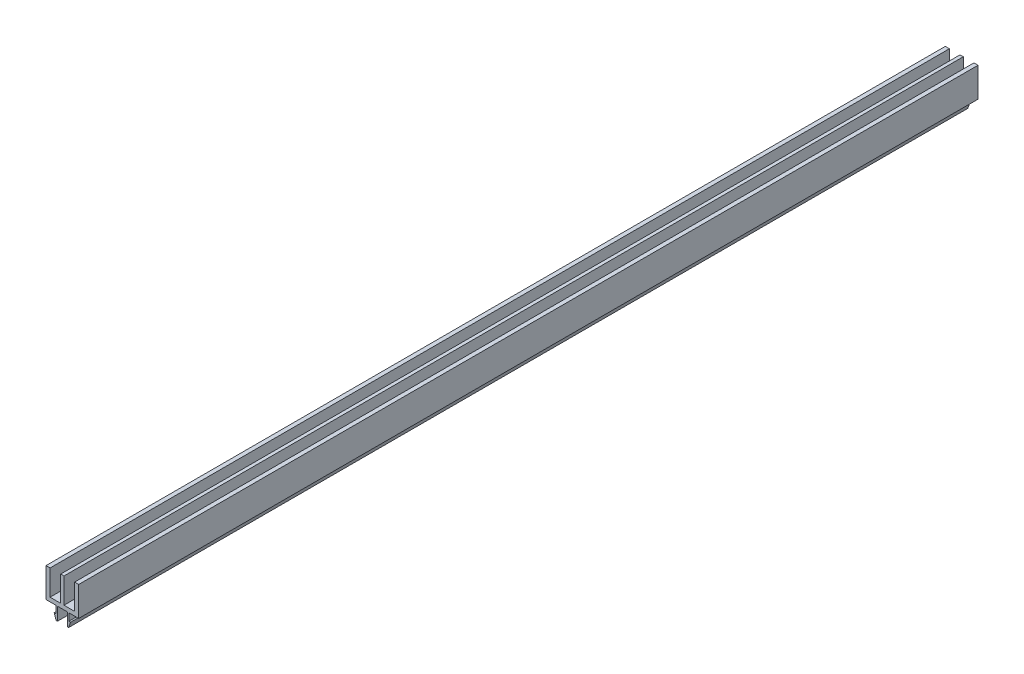
ISO-10303-21;
HEADER;
FILE_DESCRIPTION(('STEP AP214'),'2;1');
FILE_NAME('part.step','',(''),(''),'','','');
FILE_SCHEMA(('AUTOMOTIVE_DESIGN { 1 0 10303 214 1 1 1 1 }'));
ENDSEC;
DATA;
#1=APPLICATION_CONTEXT('core data for automotive mechanical design processes');
#2=APPLICATION_PROTOCOL_DEFINITION('international standard','automotive_design',2000,#1);
#3=PRODUCT_CONTEXT('',#1,'mechanical');
#4=PRODUCT('Part','Part','',(#3));
#5=PRODUCT_RELATED_PRODUCT_CATEGORY('part','',(#4));
#6=PRODUCT_DEFINITION_FORMATION('','',#4);
#7=PRODUCT_DEFINITION_CONTEXT('part definition',#1,'design');
#8=PRODUCT_DEFINITION('design','',#6,#7);
#9=PRODUCT_DEFINITION_SHAPE('','',#8);
#10=(LENGTH_UNIT() NAMED_UNIT(*) SI_UNIT(.MILLI.,.METRE.));
#11=(NAMED_UNIT(*) PLANE_ANGLE_UNIT() SI_UNIT($,.RADIAN.));
#12=(NAMED_UNIT(*) SI_UNIT($,.STERADIAN.) SOLID_ANGLE_UNIT());
#13=UNCERTAINTY_MEASURE_WITH_UNIT(LENGTH_MEASURE(1.E-05),#10,'distance_accuracy_value','');
#14=(GEOMETRIC_REPRESENTATION_CONTEXT(3) GLOBAL_UNCERTAINTY_ASSIGNED_CONTEXT((#13)) GLOBAL_UNIT_ASSIGNED_CONTEXT((#10,
#11,#12)) REPRESENTATION_CONTEXT('',''));
#15=CARTESIAN_POINT('',(0.,0.,0.));
#16=DIRECTION('',(0.,0.,1.));
#17=DIRECTION('',(1.,0.,0.));
#18=AXIS2_PLACEMENT_3D('',#15,#16,#17);
#19=CARTESIAN_POINT('',(-1.,17.9999999975,-500.));
#20=DIRECTION('',(-1.,0.,0.));
#21=DIRECTION('',(0.,-1.,0.));
#22=AXIS2_PLACEMENT_3D('',#19,#20,#21);
#23=PLANE('',#22);
#24=DIRECTION('',(0.,-1.,0.));
#25=VECTOR('',#24,1.);
#26=CARTESIAN_POINT('',(-1.,17.9999999975,50.));
#27=LINE('',#26,#25);
#28=CARTESIAN_POINT('',(-1.,17.9999999975,50.));
#29=VERTEX_POINT('',#28);
#30=CARTESIAN_POINT('',(-1.,2.4999999995,50.));
#31=VERTEX_POINT('',#30);
#32=EDGE_CURVE('E225',#29,#31,#27,.T.);
#33=ORIENTED_EDGE('',*,*,#32,.F.);
#34=DIRECTION('',(0.,0.,1.));
#35=VECTOR('',#34,1.);
#36=CARTESIAN_POINT('',(-1.,17.9999999975,-500.));
#37=LINE('',#36,#35);
#38=CARTESIAN_POINT('',(-1.,17.9999999975,-500.));
#39=VERTEX_POINT('',#38);
#40=EDGE_CURVE('E11',#39,#29,#37,.T.);
#41=ORIENTED_EDGE('',*,*,#40,.F.);
#42=DIRECTION('',(0.,-1.,0.));
#43=VECTOR('',#42,1.);
#44=CARTESIAN_POINT('',(-1.,17.9999999975,-500.));
#45=LINE('',#44,#43);
#46=CARTESIAN_POINT('',(-1.,2.4999999995,-500.));
#47=VERTEX_POINT('',#46);
#48=EDGE_CURVE('E293',#39,#47,#45,.T.);
#49=ORIENTED_EDGE('',*,*,#48,.T.);
#50=DIRECTION('',(0.,0.,1.));
#51=VECTOR('',#50,1.);
#52=CARTESIAN_POINT('',(-1.,2.4999999995,-500.));
#53=LINE('',#52,#51);
#54=EDGE_CURVE('E35',#47,#31,#53,.T.);
#55=ORIENTED_EDGE('',*,*,#54,.T.);
#56=EDGE_LOOP('',(#33,#41,#49,#55));
#57=FACE_BOUND('',#56,.T.);
#58=ADVANCED_FACE('F32',(#57),#23,.T.);
#59=CARTESIAN_POINT('',(0.999999999999998,17.9999999975,-500.));
#60=DIRECTION('',(0.,1.,0.));
#61=DIRECTION('',(0.,0.,1.));
#62=AXIS2_PLACEMENT_3D('',#59,#60,#61);
#63=PLANE('',#62);
#64=DIRECTION('',(-1.,0.,0.));
#65=VECTOR('',#64,1.);
#66=CARTESIAN_POINT('',(0.999999999999998,17.9999999975,50.));
#67=LINE('',#66,#65);
#68=CARTESIAN_POINT('',(0.999999999999998,17.9999999975,50.));
#69=VERTEX_POINT('',#68);
#70=EDGE_CURVE('E291',#69,#29,#67,.T.);
#71=ORIENTED_EDGE('',*,*,#70,.F.);
#72=DIRECTION('',(0.,0.,1.));
#73=VECTOR('',#72,1.);
#74=CARTESIAN_POINT('',(0.999999999999998,17.9999999975,-500.));
#75=LINE('',#74,#73);
#76=CARTESIAN_POINT('',(0.999999999999998,17.9999999975,-500.));
#77=VERTEX_POINT('',#76);
#78=EDGE_CURVE('E41',#77,#69,#75,.T.);
#79=ORIENTED_EDGE('',*,*,#78,.F.);
#80=DIRECTION('',(-1.,0.,0.));
#81=VECTOR('',#80,1.);
#82=CARTESIAN_POINT('',(0.999999999999998,17.9999999975,-500.));
#83=LINE('',#82,#81);
#84=EDGE_CURVE('E215',#77,#39,#83,.T.);
#85=ORIENTED_EDGE('',*,*,#84,.T.);
#86=ORIENTED_EDGE('',*,*,#40,.T.);
#87=EDGE_LOOP('',(#71,#79,#85,#86));
#88=FACE_BOUND('',#87,.T.);
#89=ADVANCED_FACE('F337',(#88),#63,.T.);
#90=CARTESIAN_POINT('',(0.999999999999998,2.4999999995,-500.));
#91=DIRECTION('',(1.,0.,0.));
#92=DIRECTION('',(0.,0.,-1.));
#93=AXIS2_PLACEMENT_3D('',#90,#91,#92);
#94=PLANE('',#93);
#95=DIRECTION('',(0.,1.,0.));
#96=VECTOR('',#95,1.);
#97=CARTESIAN_POINT('',(0.999999999999998,2.4999999995,50.));
#98=LINE('',#97,#96);
#99=CARTESIAN_POINT('',(0.999999999999998,2.4999999995,50.));
#100=VERTEX_POINT('',#99);
#101=EDGE_CURVE('E202',#100,#69,#98,.T.);
#102=ORIENTED_EDGE('',*,*,#101,.F.);
#103=DIRECTION('',(0.,0.,1.));
#104=VECTOR('',#103,1.);
#105=CARTESIAN_POINT('',(0.999999999999998,2.4999999995,-500.));
#106=LINE('',#105,#104);
#107=CARTESIAN_POINT('',(0.999999999999998,2.4999999995,-500.));
#108=VERTEX_POINT('',#107);
#109=EDGE_CURVE('E197',#108,#100,#106,.T.);
#110=ORIENTED_EDGE('',*,*,#109,.F.);
#111=DIRECTION('',(0.,1.,0.));
#112=VECTOR('',#111,1.);
#113=CARTESIAN_POINT('',(0.999999999999998,2.4999999995,-500.));
#114=LINE('',#113,#112);
#115=EDGE_CURVE('E200',#108,#77,#114,.T.);
#116=ORIENTED_EDGE('',*,*,#115,.T.);
#117=ORIENTED_EDGE('',*,*,#78,.T.);
#118=EDGE_LOOP('',(#102,#110,#116,#117));
#119=FACE_BOUND('',#118,.T.);
#120=ADVANCED_FACE('F199',(#119),#94,.T.);
#121=CARTESIAN_POINT('',(7.5,2.4999999995,-500.));
#122=DIRECTION('',(0.,1.,0.));
#123=DIRECTION('',(-1.,0.,0.));
#124=AXIS2_PLACEMENT_3D('',#121,#122,#123);
#125=PLANE('',#124);
#126=DIRECTION('',(-1.,0.,0.));
#127=VECTOR('',#126,1.);
#128=CARTESIAN_POINT('',(7.5,2.4999999995,50.));
#129=LINE('',#128,#127);
#130=CARTESIAN_POINT('',(7.5,2.4999999995,50.));
#131=VERTEX_POINT('',#130);
#132=EDGE_CURVE('E288',#131,#100,#129,.T.);
#133=ORIENTED_EDGE('',*,*,#132,.F.);
#134=DIRECTION('',(0.,0.,1.));
#135=VECTOR('',#134,1.);
#136=CARTESIAN_POINT('',(7.5,2.4999999995,-500.));
#137=LINE('',#136,#135);
#138=CARTESIAN_POINT('',(7.5,2.4999999995,-500.));
#139=VERTEX_POINT('',#138);
#140=EDGE_CURVE('E207',#139,#131,#137,.T.);
#141=ORIENTED_EDGE('',*,*,#140,.F.);
#142=DIRECTION('',(-1.,0.,0.));
#143=VECTOR('',#142,1.);
#144=CARTESIAN_POINT('',(7.5,2.4999999995,-500.));
#145=LINE('',#144,#143);
#146=EDGE_CURVE('E213',#139,#108,#145,.T.);
#147=ORIENTED_EDGE('',*,*,#146,.T.);
#148=ORIENTED_EDGE('',*,*,#109,.T.);
#149=EDGE_LOOP('',(#133,#141,#147,#148));
#150=FACE_BOUND('',#149,.T.);
#151=ADVANCED_FACE('F217',(#150),#125,.T.);
#152=CARTESIAN_POINT('',(7.5,17.9999999975,-500.));
#153=DIRECTION('',(-1.,0.,0.));
#154=DIRECTION('',(0.,-1.,0.));
#155=AXIS2_PLACEMENT_3D('',#152,#153,#154);
#156=PLANE('',#155);
#157=DIRECTION('',(0.,-1.,0.));
#158=VECTOR('',#157,1.);
#159=CARTESIAN_POINT('',(7.5,17.9999999975,50.));
#160=LINE('',#159,#158);
#161=CARTESIAN_POINT('',(7.5,17.9999999975,50.));
#162=VERTEX_POINT('',#161);
#163=EDGE_CURVE('E285',#162,#131,#160,.T.);
#164=ORIENTED_EDGE('',*,*,#163,.F.);
#165=DIRECTION('',(0.,0.,1.));
#166=VECTOR('',#165,1.);
#167=CARTESIAN_POINT('',(7.5,17.9999999975,-500.));
#168=LINE('',#167,#166);
#169=CARTESIAN_POINT('',(7.5,17.9999999975,-500.));
#170=VERTEX_POINT('',#169);
#171=EDGE_CURVE('E297',#170,#162,#168,.T.);
#172=ORIENTED_EDGE('',*,*,#171,.F.);
#173=DIRECTION('',(0.,-1.,0.));
#174=VECTOR('',#173,1.);
#175=CARTESIAN_POINT('',(7.5,17.9999999975,-500.));
#176=LINE('',#175,#174);
#177=EDGE_CURVE('E218',#170,#139,#176,.T.);
#178=ORIENTED_EDGE('',*,*,#177,.T.);
#179=ORIENTED_EDGE('',*,*,#140,.T.);
#180=EDGE_LOOP('',(#164,#172,#178,#179));
#181=FACE_BOUND('',#180,.T.);
#182=ADVANCED_FACE('F350',(#181),#156,.T.);
#183=CARTESIAN_POINT('',(10.,17.9999999975,-500.));
#184=DIRECTION('',(0.,1.,0.));
#185=DIRECTION('',(0.,0.,1.));
#186=AXIS2_PLACEMENT_3D('',#183,#184,#185);
#187=PLANE('',#186);
#188=DIRECTION('',(-1.,0.,0.));
#189=VECTOR('',#188,1.);
#190=CARTESIAN_POINT('',(10.,17.9999999975,50.));
#191=LINE('',#190,#189);
#192=CARTESIAN_POINT('',(10.,17.9999999975,50.));
#193=VERTEX_POINT('',#192);
#194=EDGE_CURVE('E282',#193,#162,#191,.T.);
#195=ORIENTED_EDGE('',*,*,#194,.F.);
#196=DIRECTION('',(0.,0.,1.));
#197=VECTOR('',#196,1.);
#198=CARTESIAN_POINT('',(10.,17.9999999975,-500.));
#199=LINE('',#198,#197);
#200=CARTESIAN_POINT('',(10.,17.9999999975,-500.));
#201=VERTEX_POINT('',#200);
#202=EDGE_CURVE('E299',#201,#193,#199,.T.);
#203=ORIENTED_EDGE('',*,*,#202,.F.);
#204=DIRECTION('',(-1.,0.,0.));
#205=VECTOR('',#204,1.);
#206=CARTESIAN_POINT('',(10.,17.9999999975,-500.));
#207=LINE('',#206,#205);
#208=EDGE_CURVE('E220',#201,#170,#207,.T.);
#209=ORIENTED_EDGE('',*,*,#208,.T.);
#210=ORIENTED_EDGE('',*,*,#171,.T.);
#211=EDGE_LOOP('',(#195,#203,#209,#210));
#212=FACE_BOUND('',#211,.T.);
#213=ADVANCED_FACE('F353',(#212),#187,.T.);
#214=CARTESIAN_POINT('',(10.,-4.99999828349541E-10,-500.));
#215=DIRECTION('',(1.,0.,0.));
#216=DIRECTION('',(0.,0.,-1.));
#217=AXIS2_PLACEMENT_3D('',#214,#215,#216);
#218=PLANE('',#217);
#219=DIRECTION('',(0.,1.,0.));
#220=VECTOR('',#219,1.);
#221=CARTESIAN_POINT('',(10.,-4.99999828349541E-10,50.));
#222=LINE('',#221,#220);
#223=CARTESIAN_POINT('',(10.,-4.99999828349541E-10,50.));
#224=VERTEX_POINT('',#223);
#225=EDGE_CURVE('E279',#224,#193,#222,.T.);
#226=ORIENTED_EDGE('',*,*,#225,.F.);
#227=DIRECTION('',(0.,0.,1.));
#228=VECTOR('',#227,1.);
#229=CARTESIAN_POINT('',(10.,-4.99999828349541E-10,-500.));
#230=LINE('',#229,#228);
#231=CARTESIAN_POINT('',(10.,-4.99999828349541E-10,-500.));
#232=VERTEX_POINT('',#231);
#233=EDGE_CURVE('E301',#232,#224,#230,.T.);
#234=ORIENTED_EDGE('',*,*,#233,.F.);
#235=DIRECTION('',(0.,1.,0.));
#236=VECTOR('',#235,1.);
#237=CARTESIAN_POINT('',(10.,-4.99999828349541E-10,-500.));
#238=LINE('',#237,#236);
#239=EDGE_CURVE('E643',#232,#201,#238,.T.);
#240=ORIENTED_EDGE('',*,*,#239,.T.);
#241=ORIENTED_EDGE('',*,*,#202,.T.);
#242=EDGE_LOOP('',(#226,#234,#240,#241));
#243=FACE_BOUND('',#242,.T.);
#244=ADVANCED_FACE('F357',(#243),#218,.T.);
#245=CARTESIAN_POINT('',(4.,-4.99999998002099E-10,-500.));
#246=DIRECTION('',(0.,-1.,0.));
#247=DIRECTION('',(1.,0.,0.));
#248=AXIS2_PLACEMENT_3D('',#245,#246,#247);
#249=PLANE('',#248);
#250=DIRECTION('',(1.,0.,0.));
#251=VECTOR('',#250,1.);
#252=CARTESIAN_POINT('',(4.,-4.99999998002099E-10,50.));
#253=LINE('',#252,#251);
#254=CARTESIAN_POINT('',(4.,-4.99999998002099E-10,50.));
#255=VERTEX_POINT('',#254);
#256=EDGE_CURVE('E276',#255,#224,#253,.T.);
#257=ORIENTED_EDGE('',*,*,#256,.F.);
#258=DIRECTION('',(0.,0.,1.));
#259=VECTOR('',#258,1.);
#260=CARTESIAN_POINT('',(4.,-4.99999998002099E-10,-500.));
#261=LINE('',#260,#259);
#262=CARTESIAN_POINT('',(4.,-4.99999998002099E-10,-500.));
#263=VERTEX_POINT('',#262);
#264=EDGE_CURVE('E303',#263,#255,#261,.T.);
#265=ORIENTED_EDGE('',*,*,#264,.F.);
#266=DIRECTION('',(1.,0.,0.));
#267=VECTOR('',#266,1.);
#268=CARTESIAN_POINT('',(4.,-4.99999998002099E-10,-500.));
#269=LINE('',#268,#267);
#270=EDGE_CURVE('E647',#263,#232,#269,.T.);
#271=ORIENTED_EDGE('',*,*,#270,.T.);
#272=ORIENTED_EDGE('',*,*,#233,.T.);
#273=EDGE_LOOP('',(#257,#265,#271,#272));
#274=FACE_BOUND('',#273,.T.);
#275=ADVANCED_FACE('F361',(#274),#249,.T.);
#276=CARTESIAN_POINT('',(4.,-4.5,-500.));
#277=DIRECTION('',(1.,0.,0.));
#278=DIRECTION('',(0.,0.,-1.));
#279=AXIS2_PLACEMENT_3D('',#276,#277,#278);
#280=PLANE('',#279);
#281=DIRECTION('',(0.,1.,0.));
#282=VECTOR('',#281,1.);
#283=CARTESIAN_POINT('',(4.,-4.5,50.));
#284=LINE('',#283,#282);
#285=CARTESIAN_POINT('',(4.,-4.5,50.));
#286=VERTEX_POINT('',#285);
#287=EDGE_CURVE('E273',#286,#255,#284,.T.);
#288=ORIENTED_EDGE('',*,*,#287,.F.);
#289=DIRECTION('',(0.,0.,1.));
#290=VECTOR('',#289,1.);
#291=CARTESIAN_POINT('',(4.,-4.5,-500.));
#292=LINE('',#291,#290);
#293=CARTESIAN_POINT('',(4.,-4.5,-500.));
#294=VERTEX_POINT('',#293);
#295=EDGE_CURVE('E305',#294,#286,#292,.T.);
#296=ORIENTED_EDGE('',*,*,#295,.F.);
#297=DIRECTION('',(0.,1.,0.));
#298=VECTOR('',#297,1.);
#299=CARTESIAN_POINT('',(4.,-4.5,-500.));
#300=LINE('',#299,#298);
#301=EDGE_CURVE('E636',#294,#263,#300,.T.);
#302=ORIENTED_EDGE('',*,*,#301,.T.);
#303=ORIENTED_EDGE('',*,*,#264,.T.);
#304=EDGE_LOOP('',(#288,#296,#302,#303));
#305=FACE_BOUND('',#304,.T.);
#306=ADVANCED_FACE('F365',(#305),#280,.T.);
#307=CARTESIAN_POINT('',(5.,-4.5,-500.));
#308=DIRECTION('',(0.,1.,0.));
#309=DIRECTION('',(0.,0.,1.));
#310=AXIS2_PLACEMENT_3D('',#307,#308,#309);
#311=PLANE('',#310);
#312=DIRECTION('',(-1.,0.,0.));
#313=VECTOR('',#312,1.);
#314=CARTESIAN_POINT('',(5.,-4.5,50.));
#315=LINE('',#314,#313);
#316=CARTESIAN_POINT('',(5.,-4.5,50.));
#317=VERTEX_POINT('',#316);
#318=EDGE_CURVE('E270',#317,#286,#315,.T.);
#319=ORIENTED_EDGE('',*,*,#318,.F.);
#320=DIRECTION('',(0.,0.,1.));
#321=VECTOR('',#320,1.);
#322=CARTESIAN_POINT('',(5.,-4.5,-500.));
#323=LINE('',#322,#321);
#324=CARTESIAN_POINT('',(5.,-4.5,-500.));
#325=VERTEX_POINT('',#324);
#326=EDGE_CURVE('E307',#325,#317,#323,.T.);
#327=ORIENTED_EDGE('',*,*,#326,.F.);
#328=DIRECTION('',(-1.,0.,0.));
#329=VECTOR('',#328,1.);
#330=CARTESIAN_POINT('',(5.,-4.5,-500.));
#331=LINE('',#330,#329);
#332=EDGE_CURVE('E632',#325,#294,#331,.T.);
#333=ORIENTED_EDGE('',*,*,#332,.T.);
#334=ORIENTED_EDGE('',*,*,#295,.T.);
#335=EDGE_LOOP('',(#319,#327,#333,#334));
#336=FACE_BOUND('',#335,.T.);
#337=ADVANCED_FACE('F369',(#336),#311,.T.);
#338=CARTESIAN_POINT('',(3.75,-8.,-500.));
#339=DIRECTION('',(0.941741911594838,-0.336336396998157,0.));
#340=DIRECTION('',(0.336336396998157,0.941741911594837,0.));
#341=AXIS2_PLACEMENT_3D('',#338,#339,#340);
#342=PLANE('',#341);
#343=DIRECTION('',(0.336336396998157,0.941741911594837,0.));
#344=VECTOR('',#343,1.);
#345=CARTESIAN_POINT('',(3.75,-8.,50.));
#346=LINE('',#345,#344);
#347=CARTESIAN_POINT('',(3.75,-8.,50.));
#348=VERTEX_POINT('',#347);
#349=EDGE_CURVE('E267',#348,#317,#346,.T.);
#350=ORIENTED_EDGE('',*,*,#349,.F.);
#351=DIRECTION('',(0.,0.,1.));
#352=VECTOR('',#351,1.);
#353=CARTESIAN_POINT('',(3.75,-8.,-500.));
#354=LINE('',#353,#352);
#355=CARTESIAN_POINT('',(3.75,-8.,-500.));
#356=VERTEX_POINT('',#355);
#357=EDGE_CURVE('E309',#356,#348,#354,.T.);
#358=ORIENTED_EDGE('',*,*,#357,.F.);
#359=DIRECTION('',(0.336336396998157,0.941741911594837,0.));
#360=VECTOR('',#359,1.);
#361=CARTESIAN_POINT('',(3.75,-8.,-500.));
#362=LINE('',#361,#360);
#363=EDGE_CURVE('E653',#356,#325,#362,.T.);
#364=ORIENTED_EDGE('',*,*,#363,.T.);
#365=ORIENTED_EDGE('',*,*,#326,.T.);
#366=EDGE_LOOP('',(#350,#358,#364,#365));
#367=FACE_BOUND('',#366,.T.);
#368=ADVANCED_FACE('F373',(#367),#342,.T.);
#369=CARTESIAN_POINT('',(3.,-8.,-500.));
#370=DIRECTION('',(0.,-1.,0.));
#371=DIRECTION('',(0.,0.,-1.));
#372=AXIS2_PLACEMENT_3D('',#369,#370,#371);
#373=PLANE('',#372);
#374=DIRECTION('',(1.,0.,0.));
#375=VECTOR('',#374,1.);
#376=CARTESIAN_POINT('',(3.,-8.,50.));
#377=LINE('',#376,#375);
#378=CARTESIAN_POINT('',(3.,-8.,50.));
#379=VERTEX_POINT('',#378);
#380=EDGE_CURVE('E264',#379,#348,#377,.T.);
#381=ORIENTED_EDGE('',*,*,#380,.F.);
#382=DIRECTION('',(0.,0.,1.));
#383=VECTOR('',#382,1.);
#384=CARTESIAN_POINT('',(3.,-8.,-500.));
#385=LINE('',#384,#383);
#386=CARTESIAN_POINT('',(3.,-8.,-500.));
#387=VERTEX_POINT('',#386);
#388=EDGE_CURVE('E311',#387,#379,#385,.T.);
#389=ORIENTED_EDGE('',*,*,#388,.F.);
#390=DIRECTION('',(1.,0.,0.));
#391=VECTOR('',#390,1.);
#392=CARTESIAN_POINT('',(3.,-8.,-500.));
#393=LINE('',#392,#391);
#394=EDGE_CURVE('E625',#387,#356,#393,.T.);
#395=ORIENTED_EDGE('',*,*,#394,.T.);
#396=ORIENTED_EDGE('',*,*,#357,.T.);
#397=EDGE_LOOP('',(#381,#389,#395,#396));
#398=FACE_BOUND('',#397,.T.);
#399=ADVANCED_FACE('F377',(#398),#373,.T.);
#400=CARTESIAN_POINT('',(3.,-4.9999985194348E-10,-500.));
#401=DIRECTION('',(-1.,0.,0.));
#402=DIRECTION('',(0.,0.,1.));
#403=AXIS2_PLACEMENT_3D('',#400,#401,#402);
#404=PLANE('',#403);
#405=DIRECTION('',(0.,-1.,0.));
#406=VECTOR('',#405,1.);
#407=CARTESIAN_POINT('',(3.,-4.9999985194348E-10,50.));
#408=LINE('',#407,#406);
#409=CARTESIAN_POINT('',(3.,-4.9999985194348E-10,50.));
#410=VERTEX_POINT('',#409);
#411=EDGE_CURVE('E261',#410,#379,#408,.T.);
#412=ORIENTED_EDGE('',*,*,#411,.F.);
#413=DIRECTION('',(0.,0.,1.));
#414=VECTOR('',#413,1.);
#415=CARTESIAN_POINT('',(3.,-4.9999985194348E-10,-500.));
#416=LINE('',#415,#414);
#417=CARTESIAN_POINT('',(3.,-4.9999985194348E-10,-500.));
#418=VERTEX_POINT('',#417);
#419=EDGE_CURVE('E313',#418,#410,#416,.T.);
#420=ORIENTED_EDGE('',*,*,#419,.F.);
#421=DIRECTION('',(0.,-1.,0.));
#422=VECTOR('',#421,1.);
#423=CARTESIAN_POINT('',(3.,-4.9999985194348E-10,-500.));
#424=LINE('',#423,#422);
#425=EDGE_CURVE('E621',#418,#387,#424,.T.);
#426=ORIENTED_EDGE('',*,*,#425,.T.);
#427=ORIENTED_EDGE('',*,*,#388,.T.);
#428=EDGE_LOOP('',(#412,#420,#426,#427));
#429=FACE_BOUND('',#428,.T.);
#430=ADVANCED_FACE('F381',(#429),#404,.T.);
#431=CARTESIAN_POINT('',(-3.,-4.99999455901012E-10,-500.));
#432=DIRECTION('',(0.,-1.,0.));
#433=DIRECTION('',(1.,0.,0.));
#434=AXIS2_PLACEMENT_3D('',#431,#432,#433);
#435=PLANE('',#434);
#436=DIRECTION('',(1.,0.,0.));
#437=VECTOR('',#436,1.);
#438=CARTESIAN_POINT('',(-3.,-4.99999455901012E-10,50.));
#439=LINE('',#438,#437);
#440=CARTESIAN_POINT('',(-3.,-4.99999455901012E-10,50.));
#441=VERTEX_POINT('',#440);
#442=EDGE_CURVE('E258',#441,#410,#439,.T.);
#443=ORIENTED_EDGE('',*,*,#442,.F.);
#444=DIRECTION('',(0.,0.,1.));
#445=VECTOR('',#444,1.);
#446=CARTESIAN_POINT('',(-3.,-4.99999455901012E-10,-500.));
#447=LINE('',#446,#445);
#448=CARTESIAN_POINT('',(-3.,-4.99999455901012E-10,-500.));
#449=VERTEX_POINT('',#448);
#450=EDGE_CURVE('E315',#449,#441,#447,.T.);
#451=ORIENTED_EDGE('',*,*,#450,.F.);
#452=DIRECTION('',(1.,0.,0.));
#453=VECTOR('',#452,1.);
#454=CARTESIAN_POINT('',(-3.,-4.99999455901012E-10,-500.));
#455=LINE('',#454,#453);
#456=EDGE_CURVE('E657',#449,#418,#455,.T.);
#457=ORIENTED_EDGE('',*,*,#456,.T.);
#458=ORIENTED_EDGE('',*,*,#419,.T.);
#459=EDGE_LOOP('',(#443,#451,#457,#458));
#460=FACE_BOUND('',#459,.T.);
#461=ADVANCED_FACE('F385',(#460),#435,.T.);
#462=CARTESIAN_POINT('',(-3.,-8.,-500.));
#463=DIRECTION('',(1.,0.,0.));
#464=DIRECTION('',(0.,0.,-1.));
#465=AXIS2_PLACEMENT_3D('',#462,#463,#464);
#466=PLANE('',#465);
#467=DIRECTION('',(0.,1.,0.));
#468=VECTOR('',#467,1.);
#469=CARTESIAN_POINT('',(-3.,-8.,50.));
#470=LINE('',#469,#468);
#471=CARTESIAN_POINT('',(-3.,-8.,50.));
#472=VERTEX_POINT('',#471);
#473=EDGE_CURVE('E255',#472,#441,#470,.T.);
#474=ORIENTED_EDGE('',*,*,#473,.F.);
#475=DIRECTION('',(0.,0.,1.));
#476=VECTOR('',#475,1.);
#477=CARTESIAN_POINT('',(-3.,-8.,-500.));
#478=LINE('',#477,#476);
#479=CARTESIAN_POINT('',(-3.,-8.,-500.));
#480=VERTEX_POINT('',#479);
#481=EDGE_CURVE('E317',#480,#472,#478,.T.);
#482=ORIENTED_EDGE('',*,*,#481,.F.);
#483=DIRECTION('',(0.,1.,0.));
#484=VECTOR('',#483,1.);
#485=CARTESIAN_POINT('',(-3.,-8.,-500.));
#486=LINE('',#485,#484);
#487=EDGE_CURVE('E614',#480,#449,#486,.T.);
#488=ORIENTED_EDGE('',*,*,#487,.T.);
#489=ORIENTED_EDGE('',*,*,#450,.T.);
#490=EDGE_LOOP('',(#474,#482,#488,#489));
#491=FACE_BOUND('',#490,.T.);
#492=ADVANCED_FACE('F389',(#491),#466,.T.);
#493=CARTESIAN_POINT('',(-3.75,-8.,-500.));
#494=DIRECTION('',(0.,-1.,0.));
#495=DIRECTION('',(0.,0.,-1.));
#496=AXIS2_PLACEMENT_3D('',#493,#494,#495);
#497=PLANE('',#496);
#498=DIRECTION('',(1.,0.,0.));
#499=VECTOR('',#498,1.);
#500=CARTESIAN_POINT('',(-3.75,-8.,50.));
#501=LINE('',#500,#499);
#502=CARTESIAN_POINT('',(-3.75,-8.,50.));
#503=VERTEX_POINT('',#502);
#504=EDGE_CURVE('E252',#503,#472,#501,.T.);
#505=ORIENTED_EDGE('',*,*,#504,.F.);
#506=DIRECTION('',(0.,0.,1.));
#507=VECTOR('',#506,1.);
#508=CARTESIAN_POINT('',(-3.75,-8.,-500.));
#509=LINE('',#508,#507);
#510=CARTESIAN_POINT('',(-3.75,-8.,-500.));
#511=VERTEX_POINT('',#510);
#512=EDGE_CURVE('E319',#511,#503,#509,.T.);
#513=ORIENTED_EDGE('',*,*,#512,.F.);
#514=DIRECTION('',(1.,0.,0.));
#515=VECTOR('',#514,1.);
#516=CARTESIAN_POINT('',(-3.75,-8.,-500.));
#517=LINE('',#516,#515);
#518=EDGE_CURVE('E610',#511,#480,#517,.T.);
#519=ORIENTED_EDGE('',*,*,#518,.T.);
#520=ORIENTED_EDGE('',*,*,#481,.T.);
#521=EDGE_LOOP('',(#505,#513,#519,#520));
#522=FACE_BOUND('',#521,.T.);
#523=ADVANCED_FACE('F393',(#522),#497,.T.);
#524=CARTESIAN_POINT('',(-5.,-4.5,-500.));
#525=DIRECTION('',(-0.941741911594837,-0.336336396998156,0.));
#526=DIRECTION('',(0.336336396998156,-0.941741911594838,0.));
#527=AXIS2_PLACEMENT_3D('',#524,#525,#526);
#528=PLANE('',#527);
#529=DIRECTION('',(0.336336396998156,-0.941741911594837,0.));
#530=VECTOR('',#529,1.);
#531=CARTESIAN_POINT('',(-5.,-4.5,50.));
#532=LINE('',#531,#530);
#533=CARTESIAN_POINT('',(-5.,-4.5,50.));
#534=VERTEX_POINT('',#533);
#535=EDGE_CURVE('E249',#534,#503,#532,.T.);
#536=ORIENTED_EDGE('',*,*,#535,.F.);
#537=DIRECTION('',(0.,0.,1.));
#538=VECTOR('',#537,1.);
#539=CARTESIAN_POINT('',(-5.,-4.5,-500.));
#540=LINE('',#539,#538);
#541=CARTESIAN_POINT('',(-5.,-4.5,-500.));
#542=VERTEX_POINT('',#541);
#543=EDGE_CURVE('E321',#542,#534,#540,.T.);
#544=ORIENTED_EDGE('',*,*,#543,.F.);
#545=DIRECTION('',(0.336336396998156,-0.941741911594837,0.));
#546=VECTOR('',#545,1.);
#547=CARTESIAN_POINT('',(-5.,-4.5,-500.));
#548=LINE('',#547,#546);
#549=EDGE_CURVE('E661',#542,#511,#548,.T.);
#550=ORIENTED_EDGE('',*,*,#549,.T.);
#551=ORIENTED_EDGE('',*,*,#512,.T.);
#552=EDGE_LOOP('',(#536,#544,#550,#551));
#553=FACE_BOUND('',#552,.T.);
#554=ADVANCED_FACE('F397',(#553),#528,.T.);
#555=CARTESIAN_POINT('',(-4.,-4.5,-500.));
#556=DIRECTION('',(0.,1.,0.));
#557=DIRECTION('',(0.,0.,1.));
#558=AXIS2_PLACEMENT_3D('',#555,#556,#557);
#559=PLANE('',#558);
#560=DIRECTION('',(-1.,0.,0.));
#561=VECTOR('',#560,1.);
#562=CARTESIAN_POINT('',(-4.,-4.5,50.));
#563=LINE('',#562,#561);
#564=CARTESIAN_POINT('',(-4.,-4.5,50.));
#565=VERTEX_POINT('',#564);
#566=EDGE_CURVE('E246',#565,#534,#563,.T.);
#567=ORIENTED_EDGE('',*,*,#566,.F.);
#568=DIRECTION('',(0.,0.,1.));
#569=VECTOR('',#568,1.);
#570=CARTESIAN_POINT('',(-4.,-4.5,-500.));
#571=LINE('',#570,#569);
#572=CARTESIAN_POINT('',(-4.,-4.5,-500.));
#573=VERTEX_POINT('',#572);
#574=EDGE_CURVE('E323',#573,#565,#571,.T.);
#575=ORIENTED_EDGE('',*,*,#574,.F.);
#576=DIRECTION('',(-1.,0.,0.));
#577=VECTOR('',#576,1.);
#578=CARTESIAN_POINT('',(-4.,-4.5,-500.));
#579=LINE('',#578,#577);
#580=EDGE_CURVE('E603',#573,#542,#579,.T.);
#581=ORIENTED_EDGE('',*,*,#580,.T.);
#582=ORIENTED_EDGE('',*,*,#543,.T.);
#583=EDGE_LOOP('',(#567,#575,#581,#582));
#584=FACE_BOUND('',#583,.T.);
#585=ADVANCED_FACE('F401',(#584),#559,.T.);
#586=CARTESIAN_POINT('',(-4.,-4.9999985194348E-10,-500.));
#587=DIRECTION('',(-1.,0.,0.));
#588=DIRECTION('',(0.,0.,1.));
#589=AXIS2_PLACEMENT_3D('',#586,#587,#588);
#590=PLANE('',#589);
#591=DIRECTION('',(0.,-1.,0.));
#592=VECTOR('',#591,1.);
#593=CARTESIAN_POINT('',(-4.,-4.9999985194348E-10,50.));
#594=LINE('',#593,#592);
#595=CARTESIAN_POINT('',(-4.,-4.9999985194348E-10,50.));
#596=VERTEX_POINT('',#595);
#597=EDGE_CURVE('E243',#596,#565,#594,.T.);
#598=ORIENTED_EDGE('',*,*,#597,.F.);
#599=DIRECTION('',(0.,0.,1.));
#600=VECTOR('',#599,1.);
#601=CARTESIAN_POINT('',(-4.,-4.9999985194348E-10,-500.));
#602=LINE('',#601,#600);
#603=CARTESIAN_POINT('',(-4.,-4.9999985194348E-10,-500.));
#604=VERTEX_POINT('',#603);
#605=EDGE_CURVE('E325',#604,#596,#602,.T.);
#606=ORIENTED_EDGE('',*,*,#605,.F.);
#607=DIRECTION('',(0.,-1.,0.));
#608=VECTOR('',#607,1.);
#609=CARTESIAN_POINT('',(-4.,-4.9999985194348E-10,-500.));
#610=LINE('',#609,#608);
#611=EDGE_CURVE('E599',#604,#573,#610,.T.);
#612=ORIENTED_EDGE('',*,*,#611,.T.);
#613=ORIENTED_EDGE('',*,*,#574,.T.);
#614=EDGE_LOOP('',(#598,#606,#612,#613));
#615=FACE_BOUND('',#614,.T.);
#616=ADVANCED_FACE('F405',(#615),#590,.T.);
#617=CARTESIAN_POINT('',(-10.,-4.99999719929324E-10,-500.));
#618=DIRECTION('',(0.,-1.,0.));
#619=DIRECTION('',(1.,0.,0.));
#620=AXIS2_PLACEMENT_3D('',#617,#618,#619);
#621=PLANE('',#620);
#622=DIRECTION('',(1.,0.,0.));
#623=VECTOR('',#622,1.);
#624=CARTESIAN_POINT('',(-10.,-4.99999719929324E-10,50.));
#625=LINE('',#624,#623);
#626=CARTESIAN_POINT('',(-10.,-4.99999719929324E-10,50.));
#627=VERTEX_POINT('',#626);
#628=EDGE_CURVE('E240',#627,#596,#625,.T.);
#629=ORIENTED_EDGE('',*,*,#628,.F.);
#630=DIRECTION('',(0.,0.,1.));
#631=VECTOR('',#630,1.);
#632=CARTESIAN_POINT('',(-10.,-4.99999719929324E-10,-500.));
#633=LINE('',#632,#631);
#634=CARTESIAN_POINT('',(-10.,-4.99999719929324E-10,-500.));
#635=VERTEX_POINT('',#634);
#636=EDGE_CURVE('E327',#635,#627,#633,.T.);
#637=ORIENTED_EDGE('',*,*,#636,.F.);
#638=DIRECTION('',(1.,0.,0.));
#639=VECTOR('',#638,1.);
#640=CARTESIAN_POINT('',(-10.,-4.99999719929324E-10,-500.));
#641=LINE('',#640,#639);
#642=EDGE_CURVE('E665',#635,#604,#641,.T.);
#643=ORIENTED_EDGE('',*,*,#642,.T.);
#644=ORIENTED_EDGE('',*,*,#605,.T.);
#645=EDGE_LOOP('',(#629,#637,#643,#644));
#646=FACE_BOUND('',#645,.T.);
#647=ADVANCED_FACE('F409',(#646),#621,.T.);
#648=CARTESIAN_POINT('',(-10.,17.9999999975,-500.));
#649=DIRECTION('',(-1.,0.,0.));
#650=DIRECTION('',(0.,-1.,0.));
#651=AXIS2_PLACEMENT_3D('',#648,#649,#650);
#652=PLANE('',#651);
#653=DIRECTION('',(0.,-1.,0.));
#654=VECTOR('',#653,1.);
#655=CARTESIAN_POINT('',(-10.,17.9999999975,50.));
#656=LINE('',#655,#654);
#657=CARTESIAN_POINT('',(-10.,17.9999999975,50.));
#658=VERTEX_POINT('',#657);
#659=EDGE_CURVE('E237',#658,#627,#656,.T.);
#660=ORIENTED_EDGE('',*,*,#659,.F.);
#661=DIRECTION('',(0.,0.,1.));
#662=VECTOR('',#661,1.);
#663=CARTESIAN_POINT('',(-10.,17.9999999975,-500.));
#664=LINE('',#663,#662);
#665=CARTESIAN_POINT('',(-10.,17.9999999975,-500.));
#666=VERTEX_POINT('',#665);
#667=EDGE_CURVE('E329',#666,#658,#664,.T.);
#668=ORIENTED_EDGE('',*,*,#667,.F.);
#669=DIRECTION('',(0.,-1.,0.));
#670=VECTOR('',#669,1.);
#671=CARTESIAN_POINT('',(-10.,17.9999999975,-500.));
#672=LINE('',#671,#670);
#673=EDGE_CURVE('E592',#666,#635,#672,.T.);
#674=ORIENTED_EDGE('',*,*,#673,.T.);
#675=ORIENTED_EDGE('',*,*,#636,.T.);
#676=EDGE_LOOP('',(#660,#668,#674,#675));
#677=FACE_BOUND('',#676,.T.);
#678=ADVANCED_FACE('F413',(#677),#652,.T.);
#679=CARTESIAN_POINT('',(-7.5,17.9999999975,-500.));
#680=DIRECTION('',(0.,1.,0.));
#681=DIRECTION('',(0.,0.,1.));
#682=AXIS2_PLACEMENT_3D('',#679,#680,#681);
#683=PLANE('',#682);
#684=DIRECTION('',(-1.,0.,0.));
#685=VECTOR('',#684,1.);
#686=CARTESIAN_POINT('',(-7.5,17.9999999975,50.));
#687=LINE('',#686,#685);
#688=CARTESIAN_POINT('',(-7.5,17.9999999975,50.));
#689=VERTEX_POINT('',#688);
#690=EDGE_CURVE('E234',#689,#658,#687,.T.);
#691=ORIENTED_EDGE('',*,*,#690,.F.);
#692=DIRECTION('',(0.,0.,1.));
#693=VECTOR('',#692,1.);
#694=CARTESIAN_POINT('',(-7.5,17.9999999975,-500.));
#695=LINE('',#694,#693);
#696=CARTESIAN_POINT('',(-7.5,17.9999999975,-500.));
#697=VERTEX_POINT('',#696);
#698=EDGE_CURVE('E331',#697,#689,#695,.T.);
#699=ORIENTED_EDGE('',*,*,#698,.F.);
#700=DIRECTION('',(-1.,0.,0.));
#701=VECTOR('',#700,1.);
#702=CARTESIAN_POINT('',(-7.5,17.9999999975,-500.));
#703=LINE('',#702,#701);
#704=EDGE_CURVE('E588',#697,#666,#703,.T.);
#705=ORIENTED_EDGE('',*,*,#704,.T.);
#706=ORIENTED_EDGE('',*,*,#667,.T.);
#707=EDGE_LOOP('',(#691,#699,#705,#706));
#708=FACE_BOUND('',#707,.T.);
#709=ADVANCED_FACE('F417',(#708),#683,.T.);
#710=CARTESIAN_POINT('',(-7.5,2.4999999995,-500.));
#711=DIRECTION('',(1.,0.,0.));
#712=DIRECTION('',(0.,0.,-1.));
#713=AXIS2_PLACEMENT_3D('',#710,#711,#712);
#714=PLANE('',#713);
#715=DIRECTION('',(0.,1.,0.));
#716=VECTOR('',#715,1.);
#717=CARTESIAN_POINT('',(-7.5,2.4999999995,50.));
#718=LINE('',#717,#716);
#719=CARTESIAN_POINT('',(-7.5,2.4999999995,50.));
#720=VERTEX_POINT('',#719);
#721=EDGE_CURVE('E231',#720,#689,#718,.T.);
#722=ORIENTED_EDGE('',*,*,#721,.F.);
#723=DIRECTION('',(0.,0.,1.));
#724=VECTOR('',#723,1.);
#725=CARTESIAN_POINT('',(-7.5,2.4999999995,-500.));
#726=LINE('',#725,#724);
#727=CARTESIAN_POINT('',(-7.5,2.4999999995,-500.));
#728=VERTEX_POINT('',#727);
#729=EDGE_CURVE('E332',#728,#720,#726,.T.);
#730=ORIENTED_EDGE('',*,*,#729,.F.);
#731=DIRECTION('',(0.,1.,0.));
#732=VECTOR('',#731,1.);
#733=CARTESIAN_POINT('',(-7.5,2.4999999995,-500.));
#734=LINE('',#733,#732);
#735=EDGE_CURVE('E669',#728,#697,#734,.T.);
#736=ORIENTED_EDGE('',*,*,#735,.T.);
#737=ORIENTED_EDGE('',*,*,#698,.T.);
#738=EDGE_LOOP('',(#722,#730,#736,#737));
#739=FACE_BOUND('',#738,.T.);
#740=ADVANCED_FACE('F421',(#739),#714,.T.);
#741=CARTESIAN_POINT('',(-1.,2.4999999995,-500.));
#742=DIRECTION('',(0.,1.,0.));
#743=DIRECTION('',(-1.,0.,0.));
#744=AXIS2_PLACEMENT_3D('',#741,#742,#743);
#745=PLANE('',#744);
#746=DIRECTION('',(-1.,0.,0.));
#747=VECTOR('',#746,1.);
#748=CARTESIAN_POINT('',(-1.,2.4999999995,50.));
#749=LINE('',#748,#747);
#750=EDGE_CURVE('E228',#31,#720,#749,.T.);
#751=ORIENTED_EDGE('',*,*,#750,.F.);
#752=ORIENTED_EDGE('',*,*,#54,.F.);
#753=DIRECTION('',(-1.,0.,0.));
#754=VECTOR('',#753,1.);
#755=CARTESIAN_POINT('',(-1.,2.4999999995,-500.));
#756=LINE('',#755,#754);
#757=EDGE_CURVE('E671',#47,#728,#756,.T.);
#758=ORIENTED_EDGE('',*,*,#757,.T.);
#759=ORIENTED_EDGE('',*,*,#729,.T.);
#760=EDGE_LOOP('',(#751,#752,#758,#759));
#761=FACE_BOUND('',#760,.T.);
#762=ADVANCED_FACE('F334',(#761),#745,.T.);
#763=CARTESIAN_POINT('',(0.,0.,-500.));
#764=DIRECTION('',(0.,0.,-1.));
#765=DIRECTION('',(-1.,0.,0.));
#766=AXIS2_PLACEMENT_3D('',#763,#764,#765);
#767=PLANE('',#766);
#768=ORIENTED_EDGE('',*,*,#48,.F.);
#769=ORIENTED_EDGE('',*,*,#84,.F.);
#770=ORIENTED_EDGE('',*,*,#115,.F.);
#771=ORIENTED_EDGE('',*,*,#146,.F.);
#772=ORIENTED_EDGE('',*,*,#177,.F.);
#773=ORIENTED_EDGE('',*,*,#208,.F.);
#774=ORIENTED_EDGE('',*,*,#239,.F.);
#775=ORIENTED_EDGE('',*,*,#270,.F.);
#776=ORIENTED_EDGE('',*,*,#301,.F.);
#777=ORIENTED_EDGE('',*,*,#332,.F.);
#778=ORIENTED_EDGE('',*,*,#363,.F.);
#779=ORIENTED_EDGE('',*,*,#394,.F.);
#780=ORIENTED_EDGE('',*,*,#425,.F.);
#781=ORIENTED_EDGE('',*,*,#456,.F.);
#782=ORIENTED_EDGE('',*,*,#487,.F.);
#783=ORIENTED_EDGE('',*,*,#518,.F.);
#784=ORIENTED_EDGE('',*,*,#549,.F.);
#785=ORIENTED_EDGE('',*,*,#580,.F.);
#786=ORIENTED_EDGE('',*,*,#611,.F.);
#787=ORIENTED_EDGE('',*,*,#642,.F.);
#788=ORIENTED_EDGE('',*,*,#673,.F.);
#789=ORIENTED_EDGE('',*,*,#704,.F.);
#790=ORIENTED_EDGE('',*,*,#735,.F.);
#791=ORIENTED_EDGE('',*,*,#757,.F.);
#792=EDGE_LOOP('',(#768,#769,#770,#771,#772,#773,#774,#775,#776,#777,#778,#779,#780,#781,#782,
#783,#784,#785,#786,#787,#788,#789,#790,#791));
#793=FACE_BOUND('',#792,.T.);
#794=ADVANCED_FACE('F211',(#793),#767,.T.);
#795=CARTESIAN_POINT('',(0.,0.,50.));
#796=DIRECTION('',(0.,0.,-1.));
#797=DIRECTION('',(-1.,0.,0.));
#798=AXIS2_PLACEMENT_3D('',#795,#796,#797);
#799=PLANE('',#798);
#800=ORIENTED_EDGE('',*,*,#32,.T.);
#801=ORIENTED_EDGE('',*,*,#750,.T.);
#802=ORIENTED_EDGE('',*,*,#721,.T.);
#803=ORIENTED_EDGE('',*,*,#690,.T.);
#804=ORIENTED_EDGE('',*,*,#659,.T.);
#805=ORIENTED_EDGE('',*,*,#628,.T.);
#806=ORIENTED_EDGE('',*,*,#597,.T.);
#807=ORIENTED_EDGE('',*,*,#566,.T.);
#808=ORIENTED_EDGE('',*,*,#535,.T.);
#809=ORIENTED_EDGE('',*,*,#504,.T.);
#810=ORIENTED_EDGE('',*,*,#473,.T.);
#811=ORIENTED_EDGE('',*,*,#442,.T.);
#812=ORIENTED_EDGE('',*,*,#411,.T.);
#813=ORIENTED_EDGE('',*,*,#380,.T.);
#814=ORIENTED_EDGE('',*,*,#349,.T.);
#815=ORIENTED_EDGE('',*,*,#318,.T.);
#816=ORIENTED_EDGE('',*,*,#287,.T.);
#817=ORIENTED_EDGE('',*,*,#256,.T.);
#818=ORIENTED_EDGE('',*,*,#225,.T.);
#819=ORIENTED_EDGE('',*,*,#194,.T.);
#820=ORIENTED_EDGE('',*,*,#163,.T.);
#821=ORIENTED_EDGE('',*,*,#132,.T.);
#822=ORIENTED_EDGE('',*,*,#101,.T.);
#823=ORIENTED_EDGE('',*,*,#70,.T.);
#824=EDGE_LOOP('',(#800,#801,#802,#803,#804,#805,#806,#807,#808,#809,#810,#811,#812,#813,#814,
#815,#816,#817,#818,#819,#820,#821,#822,#823));
#825=FACE_BOUND('',#824,.T.);
#826=ADVANCED_FACE('F336',(#825),#799,.F.);
#827=CLOSED_SHELL('',(#58,#89,#120,#151,#182,#213,#244,#275,#306,#337,#368,#399,#430,#461,#492,
#523,#554,#585,#616,#647,#678,#709,#740,#762,#794,#826));
#828=MANIFOLD_SOLID_BREP('B2',#827);
#829=ADVANCED_BREP_SHAPE_REPRESENTATION('',(#18,#828),#14);
#830=SHAPE_DEFINITION_REPRESENTATION(#9,#829);
ENDSEC;
END-ISO-10303-21;
